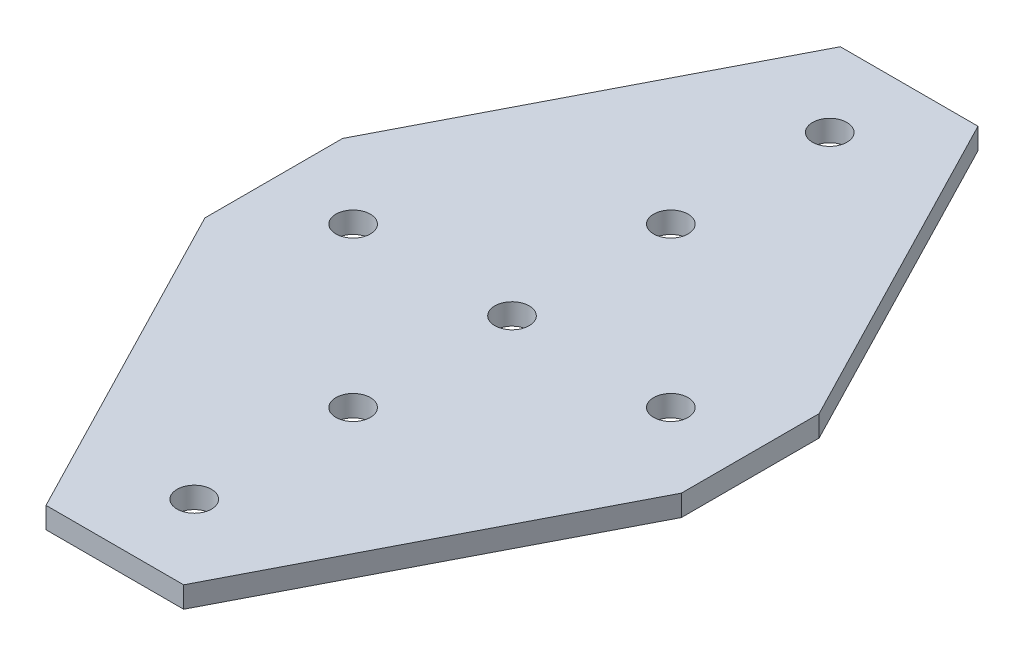
ISO-10303-21;
HEADER;
FILE_DESCRIPTION(('STEP AP214'),'2;1');
FILE_NAME('part.step','',(''),(''),'','','');
FILE_SCHEMA(('AUTOMOTIVE_DESIGN { 1 0 10303 214 1 1 1 1 }'));
ENDSEC;
DATA;
#1=APPLICATION_CONTEXT('core data for automotive mechanical design processes');
#2=APPLICATION_PROTOCOL_DEFINITION('international standard','automotive_design',2000,#1);
#3=PRODUCT_CONTEXT('',#1,'mechanical');
#4=PRODUCT('Part','Part','',(#3));
#5=PRODUCT_RELATED_PRODUCT_CATEGORY('part','',(#4));
#6=PRODUCT_DEFINITION_FORMATION('','',#4);
#7=PRODUCT_DEFINITION_CONTEXT('part definition',#1,'design');
#8=PRODUCT_DEFINITION('design','',#6,#7);
#9=PRODUCT_DEFINITION_SHAPE('','',#8);
#10=(LENGTH_UNIT() NAMED_UNIT(*) SI_UNIT(.MILLI.,.METRE.));
#11=(NAMED_UNIT(*) PLANE_ANGLE_UNIT() SI_UNIT($,.RADIAN.));
#12=(NAMED_UNIT(*) SI_UNIT($,.STERADIAN.) SOLID_ANGLE_UNIT());
#13=UNCERTAINTY_MEASURE_WITH_UNIT(LENGTH_MEASURE(1.E-05),#10,'distance_accuracy_value','');
#14=(GEOMETRIC_REPRESENTATION_CONTEXT(3) GLOBAL_UNCERTAINTY_ASSIGNED_CONTEXT((#13)) GLOBAL_UNIT_ASSIGNED_CONTEXT((#10,
#11,#12)) REPRESENTATION_CONTEXT('',''));
#15=CARTESIAN_POINT('',(0.,0.,0.));
#16=DIRECTION('',(0.,0.,1.));
#17=DIRECTION('',(1.,0.,0.));
#18=AXIS2_PLACEMENT_3D('',#15,#16,#17);
#19=CARTESIAN_POINT('',(13.,4.,0.));
#20=DIRECTION('',(-0.888620657054864,0.,0.458642919770252));
#21=DIRECTION('',(-0.458642919770252,0.,-0.888620657054864));
#22=AXIS2_PLACEMENT_3D('',#19,#20,#21);
#23=PLANE('',#22);
#24=DIRECTION('',(0.458642919770252,0.,0.888620657054864));
#25=VECTOR('',#24,1.);
#26=CARTESIAN_POINT('',(13.,0.,0.));
#27=LINE('',#26,#25);
#28=CARTESIAN_POINT('',(13.,0.,0.));
#29=VERTEX_POINT('',#28);
#30=CARTESIAN_POINT('',(45.,0.,62.));
#31=VERTEX_POINT('',#30);
#32=EDGE_CURVE('E137',#29,#31,#27,.T.);
#33=ORIENTED_EDGE('',*,*,#32,.F.);
#34=DIRECTION('',(0.,-1.,0.));
#35=VECTOR('',#34,1.);
#36=CARTESIAN_POINT('',(13.,4.,0.));
#37=LINE('',#36,#35);
#38=CARTESIAN_POINT('',(13.,4.,0.));
#39=VERTEX_POINT('',#38);
#40=EDGE_CURVE('E136',#39,#29,#37,.T.);
#41=ORIENTED_EDGE('',*,*,#40,.F.);
#42=DIRECTION('',(0.458642919770252,0.,0.888620657054864));
#43=VECTOR('',#42,1.);
#44=CARTESIAN_POINT('',(13.,4.,0.));
#45=LINE('',#44,#43);
#46=CARTESIAN_POINT('',(45.,4.,62.));
#47=VERTEX_POINT('',#46);
#48=EDGE_CURVE('E156',#39,#47,#45,.T.);
#49=ORIENTED_EDGE('',*,*,#48,.T.);
#50=DIRECTION('',(0.,-1.,0.));
#51=VECTOR('',#50,1.);
#52=CARTESIAN_POINT('',(45.,4.,62.));
#53=LINE('',#52,#51);
#54=EDGE_CURVE('E11',#47,#31,#53,.T.);
#55=ORIENTED_EDGE('',*,*,#54,.T.);
#56=EDGE_LOOP('',(#33,#41,#49,#55));
#57=FACE_BOUND('',#56,.T.);
#58=ADVANCED_FACE('F41',(#57),#23,.F.);
#59=CARTESIAN_POINT('',(45.,4.,62.));
#60=DIRECTION('',(-1.,0.,0.));
#61=DIRECTION('',(0.,0.,-1.));
#62=AXIS2_PLACEMENT_3D('',#59,#60,#61);
#63=PLANE('',#62);
#64=DIRECTION('',(0.,0.,1.));
#65=VECTOR('',#64,1.);
#66=CARTESIAN_POINT('',(45.,0.,62.));
#67=LINE('',#66,#65);
#68=CARTESIAN_POINT('',(45.,0.,88.));
#69=VERTEX_POINT('',#68);
#70=EDGE_CURVE('E139',#31,#69,#67,.T.);
#71=ORIENTED_EDGE('',*,*,#70,.F.);
#72=ORIENTED_EDGE('',*,*,#54,.F.);
#73=DIRECTION('',(0.,0.,1.));
#74=VECTOR('',#73,1.);
#75=CARTESIAN_POINT('',(45.,4.,62.));
#76=LINE('',#75,#74);
#77=CARTESIAN_POINT('',(45.,4.,88.));
#78=VERTEX_POINT('',#77);
#79=EDGE_CURVE('E95',#47,#78,#76,.T.);
#80=ORIENTED_EDGE('',*,*,#79,.T.);
#81=DIRECTION('',(0.,-1.,0.));
#82=VECTOR('',#81,1.);
#83=CARTESIAN_POINT('',(45.,4.,88.));
#84=LINE('',#83,#82);
#85=EDGE_CURVE('E49',#78,#69,#84,.T.);
#86=ORIENTED_EDGE('',*,*,#85,.T.);
#87=EDGE_LOOP('',(#71,#72,#80,#86));
#88=FACE_BOUND('',#87,.T.);
#89=ADVANCED_FACE('F168',(#88),#63,.F.);
#90=CARTESIAN_POINT('',(45.,4.,88.));
#91=DIRECTION('',(-0.888620657054864,0.,-0.458642919770252));
#92=DIRECTION('',(0.458642919770252,0.,-0.888620657054864));
#93=AXIS2_PLACEMENT_3D('',#90,#91,#92);
#94=PLANE('',#93);
#95=DIRECTION('',(-0.458642919770252,0.,0.888620657054864));
#96=VECTOR('',#95,1.);
#97=CARTESIAN_POINT('',(45.,0.,88.));
#98=LINE('',#97,#96);
#99=CARTESIAN_POINT('',(13.,0.,150.));
#100=VERTEX_POINT('',#99);
#101=EDGE_CURVE('E143',#69,#100,#98,.T.);
#102=ORIENTED_EDGE('',*,*,#101,.F.);
#103=ORIENTED_EDGE('',*,*,#85,.F.);
#104=DIRECTION('',(-0.458642919770252,0.,0.888620657054864));
#105=VECTOR('',#104,1.);
#106=CARTESIAN_POINT('',(45.,4.,88.));
#107=LINE('',#106,#105);
#108=CARTESIAN_POINT('',(13.,4.,150.));
#109=VERTEX_POINT('',#108);
#110=EDGE_CURVE('E177',#78,#109,#107,.T.);
#111=ORIENTED_EDGE('',*,*,#110,.T.);
#112=DIRECTION('',(0.,-1.,0.));
#113=VECTOR('',#112,1.);
#114=CARTESIAN_POINT('',(13.,4.,150.));
#115=LINE('',#114,#113);
#116=EDGE_CURVE('E163',#109,#100,#115,.T.);
#117=ORIENTED_EDGE('',*,*,#116,.T.);
#118=EDGE_LOOP('',(#102,#103,#111,#117));
#119=FACE_BOUND('',#118,.T.);
#120=ADVANCED_FACE('F190',(#119),#94,.F.);
#121=CARTESIAN_POINT('',(13.,4.,150.));
#122=DIRECTION('',(0.,0.,-1.));
#123=DIRECTION('',(1.,0.,0.));
#124=AXIS2_PLACEMENT_3D('',#121,#122,#123);
#125=PLANE('',#124);
#126=DIRECTION('',(-1.,0.,0.));
#127=VECTOR('',#126,1.);
#128=CARTESIAN_POINT('',(13.,0.,150.));
#129=LINE('',#128,#127);
#130=CARTESIAN_POINT('',(-13.,0.,150.));
#131=VERTEX_POINT('',#130);
#132=EDGE_CURVE('E146',#100,#131,#129,.T.);
#133=ORIENTED_EDGE('',*,*,#132,.F.);
#134=ORIENTED_EDGE('',*,*,#116,.F.);
#135=DIRECTION('',(-1.,0.,0.));
#136=VECTOR('',#135,1.);
#137=CARTESIAN_POINT('',(13.,4.,150.));
#138=LINE('',#137,#136);
#139=CARTESIAN_POINT('',(-13.,4.,150.));
#140=VERTEX_POINT('',#139);
#141=EDGE_CURVE('E131',#109,#140,#138,.T.);
#142=ORIENTED_EDGE('',*,*,#141,.T.);
#143=DIRECTION('',(0.,-1.,0.));
#144=VECTOR('',#143,1.);
#145=CARTESIAN_POINT('',(-13.,4.,150.));
#146=LINE('',#145,#144);
#147=EDGE_CURVE('E160',#140,#131,#146,.T.);
#148=ORIENTED_EDGE('',*,*,#147,.T.);
#149=EDGE_LOOP('',(#133,#134,#142,#148));
#150=FACE_BOUND('',#149,.T.);
#151=ADVANCED_FACE('F186',(#150),#125,.F.);
#152=CARTESIAN_POINT('',(-45.,4.,88.));
#153=DIRECTION('',(0.888620657054864,0.,-0.458642919770252));
#154=DIRECTION('',(0.458642919770252,0.,0.888620657054864));
#155=AXIS2_PLACEMENT_3D('',#152,#153,#154);
#156=PLANE('',#155);
#157=DIRECTION('',(-0.458642919770252,0.,-0.888620657054864));
#158=VECTOR('',#157,1.);
#159=CARTESIAN_POINT('',(-45.,0.,88.));
#160=LINE('',#159,#158);
#161=CARTESIAN_POINT('',(-45.,0.,88.));
#162=VERTEX_POINT('',#161);
#163=EDGE_CURVE('E149',#131,#162,#160,.T.);
#164=ORIENTED_EDGE('',*,*,#163,.F.);
#165=ORIENTED_EDGE('',*,*,#147,.F.);
#166=DIRECTION('',(-0.458642919770252,0.,-0.888620657054864));
#167=VECTOR('',#166,1.);
#168=CARTESIAN_POINT('',(-45.,4.,88.));
#169=LINE('',#168,#167);
#170=CARTESIAN_POINT('',(-45.,4.,88.));
#171=VERTEX_POINT('',#170);
#172=EDGE_CURVE('E129',#140,#171,#169,.T.);
#173=ORIENTED_EDGE('',*,*,#172,.T.);
#174=DIRECTION('',(0.,-1.,0.));
#175=VECTOR('',#174,1.);
#176=CARTESIAN_POINT('',(-45.,4.,88.));
#177=LINE('',#176,#175);
#178=EDGE_CURVE('E123',#171,#162,#177,.T.);
#179=ORIENTED_EDGE('',*,*,#178,.T.);
#180=EDGE_LOOP('',(#164,#165,#173,#179));
#181=FACE_BOUND('',#180,.T.);
#182=ADVANCED_FACE('F189',(#181),#156,.F.);
#183=CARTESIAN_POINT('',(-45.,4.,62.));
#184=DIRECTION('',(1.,0.,0.));
#185=DIRECTION('',(0.,0.,1.));
#186=AXIS2_PLACEMENT_3D('',#183,#184,#185);
#187=PLANE('',#186);
#188=DIRECTION('',(0.,0.,-1.));
#189=VECTOR('',#188,1.);
#190=CARTESIAN_POINT('',(-45.,0.,62.));
#191=LINE('',#190,#189);
#192=CARTESIAN_POINT('',(-45.,0.,62.));
#193=VERTEX_POINT('',#192);
#194=EDGE_CURVE('E152',#162,#193,#191,.T.);
#195=ORIENTED_EDGE('',*,*,#194,.F.);
#196=ORIENTED_EDGE('',*,*,#178,.F.);
#197=DIRECTION('',(0.,0.,-1.));
#198=VECTOR('',#197,1.);
#199=CARTESIAN_POINT('',(-45.,4.,62.));
#200=LINE('',#199,#198);
#201=CARTESIAN_POINT('',(-45.,4.,62.));
#202=VERTEX_POINT('',#201);
#203=EDGE_CURVE('E113',#171,#202,#200,.T.);
#204=ORIENTED_EDGE('',*,*,#203,.T.);
#205=DIRECTION('',(0.,-1.,0.));
#206=VECTOR('',#205,1.);
#207=CARTESIAN_POINT('',(-45.,4.,62.));
#208=LINE('',#207,#206);
#209=EDGE_CURVE('E118',#202,#193,#208,.T.);
#210=ORIENTED_EDGE('',*,*,#209,.T.);
#211=EDGE_LOOP('',(#195,#196,#204,#210));
#212=FACE_BOUND('',#211,.T.);
#213=ADVANCED_FACE('F126',(#212),#187,.F.);
#214=CARTESIAN_POINT('',(-13.,4.,0.));
#215=DIRECTION('',(0.888620657054864,0.,0.458642919770252));
#216=DIRECTION('',(-0.458642919770252,0.,0.888620657054864));
#217=AXIS2_PLACEMENT_3D('',#214,#215,#216);
#218=PLANE('',#217);
#219=DIRECTION('',(0.458642919770252,0.,-0.888620657054864));
#220=VECTOR('',#219,1.);
#221=CARTESIAN_POINT('',(-13.,0.,0.));
#222=LINE('',#221,#220);
#223=CARTESIAN_POINT('',(-13.,0.,0.));
#224=VERTEX_POINT('',#223);
#225=EDGE_CURVE('E120',#193,#224,#222,.T.);
#226=ORIENTED_EDGE('',*,*,#225,.F.);
#227=ORIENTED_EDGE('',*,*,#209,.F.);
#228=DIRECTION('',(0.458642919770252,0.,-0.888620657054864));
#229=VECTOR('',#228,1.);
#230=CARTESIAN_POINT('',(-13.,4.,0.));
#231=LINE('',#230,#229);
#232=CARTESIAN_POINT('',(-13.,4.,0.));
#233=VERTEX_POINT('',#232);
#234=EDGE_CURVE('E109',#202,#233,#231,.T.);
#235=ORIENTED_EDGE('',*,*,#234,.T.);
#236=DIRECTION('',(0.,-1.,0.));
#237=VECTOR('',#236,1.);
#238=CARTESIAN_POINT('',(-13.,4.,0.));
#239=LINE('',#238,#237);
#240=EDGE_CURVE('E124',#233,#224,#239,.T.);
#241=ORIENTED_EDGE('',*,*,#240,.T.);
#242=EDGE_LOOP('',(#226,#227,#235,#241));
#243=FACE_BOUND('',#242,.T.);
#244=ADVANCED_FACE('F119',(#243),#218,.F.);
#245=CARTESIAN_POINT('',(-13.,4.,0.));
#246=DIRECTION('',(0.,0.,1.));
#247=DIRECTION('',(-1.,0.,0.));
#248=AXIS2_PLACEMENT_3D('',#245,#246,#247);
#249=PLANE('',#248);
#250=DIRECTION('',(1.,0.,0.));
#251=VECTOR('',#250,1.);
#252=CARTESIAN_POINT('',(-13.,0.,0.));
#253=LINE('',#252,#251);
#254=EDGE_CURVE('E83',#224,#29,#253,.T.);
#255=ORIENTED_EDGE('',*,*,#254,.F.);
#256=ORIENTED_EDGE('',*,*,#240,.F.);
#257=DIRECTION('',(1.,0.,0.));
#258=VECTOR('',#257,1.);
#259=CARTESIAN_POINT('',(-13.,4.,0.));
#260=LINE('',#259,#258);
#261=EDGE_CURVE('E57',#233,#39,#260,.T.);
#262=ORIENTED_EDGE('',*,*,#261,.T.);
#263=ORIENTED_EDGE('',*,*,#40,.T.);
#264=EDGE_LOOP('',(#255,#256,#262,#263));
#265=FACE_BOUND('',#264,.T.);
#266=ADVANCED_FACE('F244',(#265),#249,.F.);
#267=CARTESIAN_POINT('',(0.,4.,0.));
#268=DIRECTION('',(0.,1.,0.));
#269=DIRECTION('',(0.,0.,-1.));
#270=AXIS2_PLACEMENT_3D('',#267,#268,#269);
#271=PLANE('',#270);
#272=CARTESIAN_POINT('',(5.83159337170879E-13,4.,15.));
#273=DIRECTION('',(0.,-1.,0.));
#274=DIRECTION('',(0.,0.,-1.));
#275=AXIS2_PLACEMENT_3D('',#272,#273,#274);
#276=CIRCLE('',#275,3.24999999999984);
#277=CARTESIAN_POINT('',(5.83159337170879E-13,4.,11.7500000000002));
#278=VERTEX_POINT('',#277);
#279=EDGE_CURVE('E347',#278,#278,#276,.T.);
#280=ORIENTED_EDGE('',*,*,#279,.T.);
#281=EDGE_LOOP('',(#280));
#282=FACE_BOUND('',#281,.T.);
#283=CARTESIAN_POINT('',(2.70762986873718E-13,4.,45.));
#284=DIRECTION('',(0.,-1.,0.));
#285=DIRECTION('',(0.,0.,-1.));
#286=AXIS2_PLACEMENT_3D('',#283,#284,#285);
#287=CIRCLE('',#286,3.24999999999984);
#288=CARTESIAN_POINT('',(2.70762986873718E-13,4.,41.7500000000002));
#289=VERTEX_POINT('',#288);
#290=EDGE_CURVE('E351',#289,#289,#287,.T.);
#291=ORIENTED_EDGE('',*,*,#290,.T.);
#292=EDGE_LOOP('',(#291));
#293=FACE_BOUND('',#292,.T.);
#294=CARTESIAN_POINT('',(-2.47448303356589E-13,4.,135.));
#295=DIRECTION('',(0.,-1.,0.));
#296=DIRECTION('',(0.,0.,-1.));
#297=AXIS2_PLACEMENT_3D('',#294,#295,#296);
#298=CIRCLE('',#297,3.24999999999983);
#299=CARTESIAN_POINT('',(-2.47448303356589E-13,4.,131.75));
#300=VERTEX_POINT('',#299);
#301=EDGE_CURVE('E381',#300,#300,#298,.T.);
#302=ORIENTED_EDGE('',*,*,#301,.T.);
#303=EDGE_LOOP('',(#302));
#304=FACE_BOUND('',#303,.T.);
#305=CARTESIAN_POINT('',(-1.44540833390016E-13,4.,105.));
#306=DIRECTION('',(0.,-1.,0.));
#307=DIRECTION('',(0.,0.,-1.));
#308=AXIS2_PLACEMENT_3D('',#305,#306,#307);
#309=CIRCLE('',#308,3.24999999999983);
#310=CARTESIAN_POINT('',(-1.44540833390016E-13,4.,101.75));
#311=VERTEX_POINT('',#310);
#312=EDGE_CURVE('E375',#311,#311,#309,.T.);
#313=ORIENTED_EDGE('',*,*,#312,.T.);
#314=EDGE_LOOP('',(#313));
#315=FACE_BOUND('',#314,.T.);
#316=CARTESIAN_POINT('',(-30.,4.,74.9999999999998));
#317=DIRECTION('',(0.,-1.,0.));
#318=DIRECTION('',(0.,0.,-1.));
#319=AXIS2_PLACEMENT_3D('',#316,#317,#318);
#320=CIRCLE('',#319,3.24999999999984);
#321=CARTESIAN_POINT('',(-30.,4.,71.75));
#322=VERTEX_POINT('',#321);
#323=EDGE_CURVE('E367',#322,#322,#320,.T.);
#324=ORIENTED_EDGE('',*,*,#323,.T.);
#325=EDGE_LOOP('',(#324));
#326=FACE_BOUND('',#325,.T.);
#327=CARTESIAN_POINT('',(30.,4.,75.));
#328=DIRECTION('',(0.,-1.,0.));
#329=DIRECTION('',(0.,0.,-1.));
#330=AXIS2_PLACEMENT_3D('',#327,#328,#329);
#331=CIRCLE('',#330,3.24999999999983);
#332=CARTESIAN_POINT('',(30.,4.,71.7500000000002));
#333=VERTEX_POINT('',#332);
#334=EDGE_CURVE('E358',#333,#333,#331,.T.);
#335=ORIENTED_EDGE('',*,*,#334,.T.);
#336=EDGE_LOOP('',(#335));
#337=FACE_BOUND('',#336,.T.);
#338=CARTESIAN_POINT('',(0.,4.,75.));
#339=DIRECTION('',(0.,-1.,0.));
#340=DIRECTION('',(0.,0.,-1.));
#341=AXIS2_PLACEMENT_3D('',#338,#339,#340);
#342=CIRCLE('',#341,3.24999999999983);
#343=CARTESIAN_POINT('',(0.,4.,71.7500000000002));
#344=VERTEX_POINT('',#343);
#345=EDGE_CURVE('E180',#344,#344,#342,.T.);
#346=ORIENTED_EDGE('',*,*,#345,.T.);
#347=EDGE_LOOP('',(#346));
#348=FACE_BOUND('',#347,.T.);
#349=ORIENTED_EDGE('',*,*,#48,.F.);
#350=ORIENTED_EDGE('',*,*,#261,.F.);
#351=ORIENTED_EDGE('',*,*,#234,.F.);
#352=ORIENTED_EDGE('',*,*,#203,.F.);
#353=ORIENTED_EDGE('',*,*,#172,.F.);
#354=ORIENTED_EDGE('',*,*,#141,.F.);
#355=ORIENTED_EDGE('',*,*,#110,.F.);
#356=ORIENTED_EDGE('',*,*,#79,.F.);
#357=EDGE_LOOP('',(#349,#350,#351,#352,#353,#354,#355,#356));
#358=FACE_BOUND('',#357,.T.);
#359=ADVANCED_FACE('F111',(#282,#293,#304,#315,#326,#337,#348,#358),#271,.T.);
#360=CARTESIAN_POINT('',(0.,0.,0.));
#361=DIRECTION('',(0.,1.,0.));
#362=DIRECTION('',(0.,0.,-1.));
#363=AXIS2_PLACEMENT_3D('',#360,#361,#362);
#364=PLANE('',#363);
#365=CARTESIAN_POINT('',(5.83159337170879E-13,0.,15.));
#366=DIRECTION('',(0.,-1.,0.));
#367=DIRECTION('',(0.,0.,-1.));
#368=AXIS2_PLACEMENT_3D('',#365,#366,#367);
#369=CIRCLE('',#368,3.24999999999984);
#370=CARTESIAN_POINT('',(5.83159337170879E-13,0.,11.7500000000002));
#371=VERTEX_POINT('',#370);
#372=EDGE_CURVE('E344',#371,#371,#369,.T.);
#373=ORIENTED_EDGE('',*,*,#372,.F.);
#374=EDGE_LOOP('',(#373));
#375=FACE_BOUND('',#374,.T.);
#376=CARTESIAN_POINT('',(2.70762986873718E-13,0.,45.));
#377=DIRECTION('',(0.,-1.,0.));
#378=DIRECTION('',(0.,0.,-1.));
#379=AXIS2_PLACEMENT_3D('',#376,#377,#378);
#380=CIRCLE('',#379,3.24999999999984);
#381=CARTESIAN_POINT('',(2.70762986873718E-13,0.,41.7500000000002));
#382=VERTEX_POINT('',#381);
#383=EDGE_CURVE('E348',#382,#382,#380,.T.);
#384=ORIENTED_EDGE('',*,*,#383,.F.);
#385=EDGE_LOOP('',(#384));
#386=FACE_BOUND('',#385,.T.);
#387=CARTESIAN_POINT('',(-2.47448303356589E-13,0.,135.));
#388=DIRECTION('',(0.,-1.,0.));
#389=DIRECTION('',(0.,0.,-1.));
#390=AXIS2_PLACEMENT_3D('',#387,#388,#389);
#391=CIRCLE('',#390,3.24999999999983);
#392=CARTESIAN_POINT('',(-2.47448303356589E-13,0.,131.75));
#393=VERTEX_POINT('',#392);
#394=EDGE_CURVE('E384',#393,#393,#391,.T.);
#395=ORIENTED_EDGE('',*,*,#394,.F.);
#396=EDGE_LOOP('',(#395));
#397=FACE_BOUND('',#396,.T.);
#398=CARTESIAN_POINT('',(-1.44540833390016E-13,0.,105.));
#399=DIRECTION('',(0.,-1.,0.));
#400=DIRECTION('',(0.,0.,-1.));
#401=AXIS2_PLACEMENT_3D('',#398,#399,#400);
#402=CIRCLE('',#401,3.24999999999983);
#403=CARTESIAN_POINT('',(-1.44540833390016E-13,0.,101.75));
#404=VERTEX_POINT('',#403);
#405=EDGE_CURVE('E378',#404,#404,#402,.T.);
#406=ORIENTED_EDGE('',*,*,#405,.F.);
#407=EDGE_LOOP('',(#406));
#408=FACE_BOUND('',#407,.T.);
#409=CARTESIAN_POINT('',(-30.,0.,74.9999999999998));
#410=DIRECTION('',(0.,-1.,0.));
#411=DIRECTION('',(0.,0.,-1.));
#412=AXIS2_PLACEMENT_3D('',#409,#410,#411);
#413=CIRCLE('',#412,3.24999999999984);
#414=CARTESIAN_POINT('',(-30.,0.,71.75));
#415=VERTEX_POINT('',#414);
#416=EDGE_CURVE('E372',#415,#415,#413,.T.);
#417=ORIENTED_EDGE('',*,*,#416,.F.);
#418=EDGE_LOOP('',(#417));
#419=FACE_BOUND('',#418,.T.);
#420=CARTESIAN_POINT('',(30.,0.,75.));
#421=DIRECTION('',(0.,-1.,0.));
#422=DIRECTION('',(0.,0.,-1.));
#423=AXIS2_PLACEMENT_3D('',#420,#421,#422);
#424=CIRCLE('',#423,3.24999999999983);
#425=CARTESIAN_POINT('',(30.,0.,71.7500000000002));
#426=VERTEX_POINT('',#425);
#427=EDGE_CURVE('E362',#426,#426,#424,.T.);
#428=ORIENTED_EDGE('',*,*,#427,.F.);
#429=EDGE_LOOP('',(#428));
#430=FACE_BOUND('',#429,.T.);
#431=CARTESIAN_POINT('',(0.,0.,75.));
#432=DIRECTION('',(0.,-1.,0.));
#433=DIRECTION('',(0.,0.,-1.));
#434=AXIS2_PLACEMENT_3D('',#431,#432,#433);
#435=CIRCLE('',#434,3.24999999999983);
#436=CARTESIAN_POINT('',(0.,0.,71.7500000000002));
#437=VERTEX_POINT('',#436);
#438=EDGE_CURVE('E140',#437,#437,#435,.T.);
#439=ORIENTED_EDGE('',*,*,#438,.F.);
#440=EDGE_LOOP('',(#439));
#441=FACE_BOUND('',#440,.T.);
#442=ORIENTED_EDGE('',*,*,#32,.T.);
#443=ORIENTED_EDGE('',*,*,#70,.T.);
#444=ORIENTED_EDGE('',*,*,#101,.T.);
#445=ORIENTED_EDGE('',*,*,#132,.T.);
#446=ORIENTED_EDGE('',*,*,#163,.T.);
#447=ORIENTED_EDGE('',*,*,#194,.T.);
#448=ORIENTED_EDGE('',*,*,#225,.T.);
#449=ORIENTED_EDGE('',*,*,#254,.T.);
#450=EDGE_LOOP('',(#442,#443,#444,#445,#446,#447,#448,#449));
#451=FACE_BOUND('',#450,.T.);
#452=ADVANCED_FACE('F171',(#375,#386,#397,#408,#419,#430,#441,#451),#364,.F.);
#453=CARTESIAN_POINT('',(0.,0.,75.));
#454=DIRECTION('',(0.,1.,0.));
#455=DIRECTION('',(0.,0.,-1.));
#456=AXIS2_PLACEMENT_3D('',#453,#454,#455);
#457=CYLINDRICAL_SURFACE('',#456,3.24999999999983);
#458=ORIENTED_EDGE('',*,*,#438,.T.);
#459=EDGE_LOOP('',(#458));
#460=FACE_BOUND('',#459,.T.);
#461=ORIENTED_EDGE('',*,*,#345,.F.);
#462=EDGE_LOOP('',(#461));
#463=FACE_BOUND('',#462,.T.);
#464=ADVANCED_FACE('F270',(#460,#463),#457,.F.);
#465=CARTESIAN_POINT('',(30.,0.,75.));
#466=DIRECTION('',(0.,1.,0.));
#467=DIRECTION('',(0.,0.,-1.));
#468=AXIS2_PLACEMENT_3D('',#465,#466,#467);
#469=CYLINDRICAL_SURFACE('',#468,3.24999999999983);
#470=ORIENTED_EDGE('',*,*,#427,.T.);
#471=EDGE_LOOP('',(#470));
#472=FACE_BOUND('',#471,.T.);
#473=ORIENTED_EDGE('',*,*,#334,.F.);
#474=EDGE_LOOP('',(#473));
#475=FACE_BOUND('',#474,.T.);
#476=ADVANCED_FACE('F280',(#472,#475),#469,.F.);
#477=CARTESIAN_POINT('',(-30.,0.,74.9999999999998));
#478=DIRECTION('',(0.,1.,0.));
#479=DIRECTION('',(0.,0.,-1.));
#480=AXIS2_PLACEMENT_3D('',#477,#478,#479);
#481=CYLINDRICAL_SURFACE('',#480,3.24999999999984);
#482=ORIENTED_EDGE('',*,*,#416,.T.);
#483=EDGE_LOOP('',(#482));
#484=FACE_BOUND('',#483,.T.);
#485=ORIENTED_EDGE('',*,*,#323,.F.);
#486=EDGE_LOOP('',(#485));
#487=FACE_BOUND('',#486,.T.);
#488=ADVANCED_FACE('F289',(#484,#487),#481,.F.);
#489=CARTESIAN_POINT('',(-1.44540833390016E-13,0.,105.));
#490=DIRECTION('',(0.,1.,0.));
#491=DIRECTION('',(0.,0.,-1.));
#492=AXIS2_PLACEMENT_3D('',#489,#490,#491);
#493=CYLINDRICAL_SURFACE('',#492,3.24999999999983);
#494=ORIENTED_EDGE('',*,*,#405,.T.);
#495=EDGE_LOOP('',(#494));
#496=FACE_BOUND('',#495,.T.);
#497=ORIENTED_EDGE('',*,*,#312,.F.);
#498=EDGE_LOOP('',(#497));
#499=FACE_BOUND('',#498,.T.);
#500=ADVANCED_FACE('F298',(#496,#499),#493,.F.);
#501=CARTESIAN_POINT('',(-2.47448303356589E-13,0.,135.));
#502=DIRECTION('',(0.,1.,0.));
#503=DIRECTION('',(0.,0.,-1.));
#504=AXIS2_PLACEMENT_3D('',#501,#502,#503);
#505=CYLINDRICAL_SURFACE('',#504,3.24999999999983);
#506=ORIENTED_EDGE('',*,*,#394,.T.);
#507=EDGE_LOOP('',(#506));
#508=FACE_BOUND('',#507,.T.);
#509=ORIENTED_EDGE('',*,*,#301,.F.);
#510=EDGE_LOOP('',(#509));
#511=FACE_BOUND('',#510,.T.);
#512=ADVANCED_FACE('F308',(#508,#511),#505,.F.);
#513=CARTESIAN_POINT('',(2.70762986873718E-13,0.,45.));
#514=DIRECTION('',(0.,1.,0.));
#515=DIRECTION('',(0.,0.,-1.));
#516=AXIS2_PLACEMENT_3D('',#513,#514,#515);
#517=CYLINDRICAL_SURFACE('',#516,3.24999999999984);
#518=ORIENTED_EDGE('',*,*,#383,.T.);
#519=EDGE_LOOP('',(#518));
#520=FACE_BOUND('',#519,.T.);
#521=ORIENTED_EDGE('',*,*,#290,.F.);
#522=EDGE_LOOP('',(#521));
#523=FACE_BOUND('',#522,.T.);
#524=ADVANCED_FACE('F318',(#520,#523),#517,.F.);
#525=CARTESIAN_POINT('',(5.83159337170879E-13,0.,15.));
#526=DIRECTION('',(0.,1.,0.));
#527=DIRECTION('',(0.,0.,-1.));
#528=AXIS2_PLACEMENT_3D('',#525,#526,#527);
#529=CYLINDRICAL_SURFACE('',#528,3.24999999999984);
#530=ORIENTED_EDGE('',*,*,#372,.T.);
#531=EDGE_LOOP('',(#530));
#532=FACE_BOUND('',#531,.T.);
#533=ORIENTED_EDGE('',*,*,#279,.F.);
#534=EDGE_LOOP('',(#533));
#535=FACE_BOUND('',#534,.T.);
#536=ADVANCED_FACE('F328',(#532,#535),#529,.F.);
#537=CLOSED_SHELL('',(#58,#89,#120,#151,#182,#213,#244,#266,#359,#452,#464,#476,#488,#500,#512,
#524,#536));
#538=MANIFOLD_SOLID_BREP('B2',#537);
#539=ADVANCED_BREP_SHAPE_REPRESENTATION('',(#18,#538),#14);
#540=SHAPE_DEFINITION_REPRESENTATION(#9,#539);
ENDSEC;
END-ISO-10303-21;
